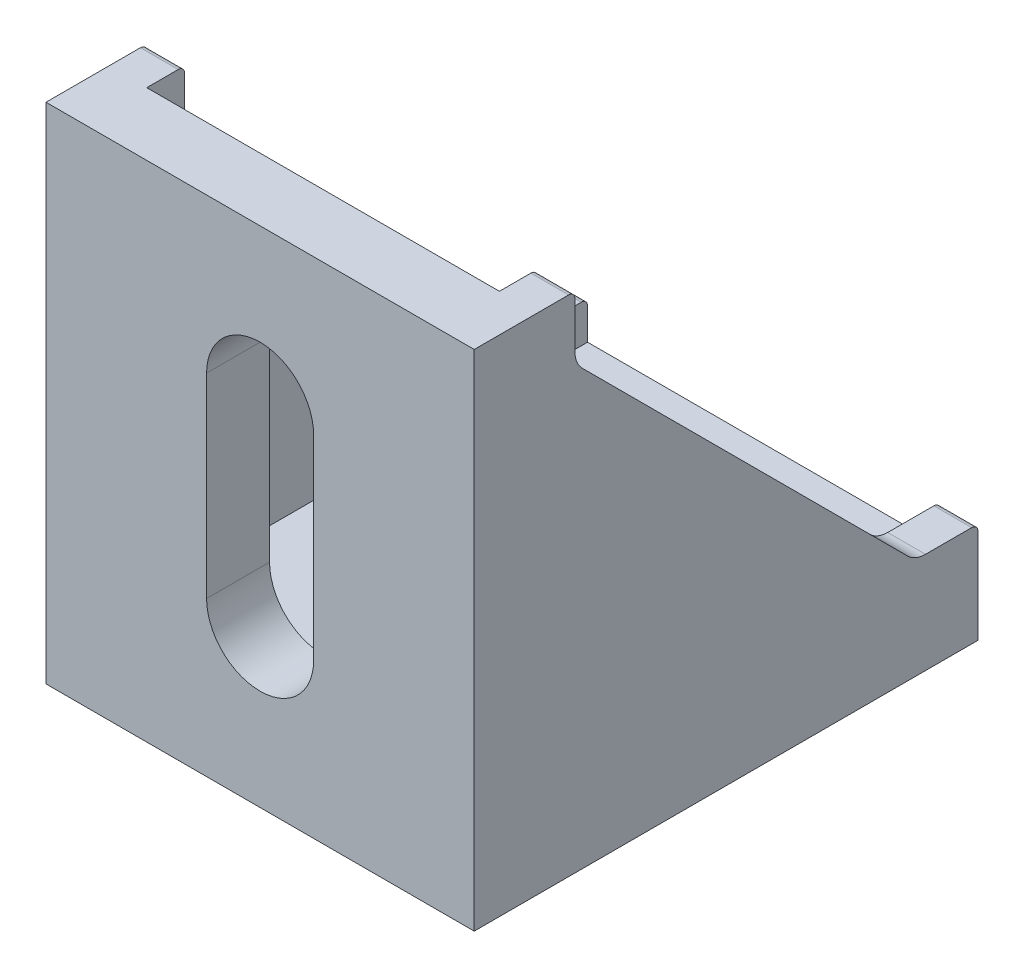
ISO-10303-21;
HEADER;
FILE_DESCRIPTION(('STEP AP214'),'2;1');
FILE_NAME('part.step','',(''),(''),'','','');
FILE_SCHEMA(('AUTOMOTIVE_DESIGN { 1 0 10303 214 1 1 1 1 }'));
ENDSEC;
DATA;
#1=APPLICATION_CONTEXT('core data for automotive mechanical design processes');
#2=APPLICATION_PROTOCOL_DEFINITION('international standard','automotive_design',2000,#1);
#3=PRODUCT_CONTEXT('',#1,'mechanical');
#4=PRODUCT('Part','Part','',(#3));
#5=PRODUCT_RELATED_PRODUCT_CATEGORY('part','',(#4));
#6=PRODUCT_DEFINITION_FORMATION('','',#4);
#7=PRODUCT_DEFINITION_CONTEXT('part definition',#1,'design');
#8=PRODUCT_DEFINITION('design','',#6,#7);
#9=PRODUCT_DEFINITION_SHAPE('','',#8);
#10=(LENGTH_UNIT() NAMED_UNIT(*) SI_UNIT(.MILLI.,.METRE.));
#11=(NAMED_UNIT(*) PLANE_ANGLE_UNIT() SI_UNIT($,.RADIAN.));
#12=(NAMED_UNIT(*) SI_UNIT($,.STERADIAN.) SOLID_ANGLE_UNIT());
#13=UNCERTAINTY_MEASURE_WITH_UNIT(LENGTH_MEASURE(1.E-05),#10,'distance_accuracy_value','');
#14=(GEOMETRIC_REPRESENTATION_CONTEXT(3) GLOBAL_UNCERTAINTY_ASSIGNED_CONTEXT((#13)) GLOBAL_UNIT_ASSIGNED_CONTEXT((#10,
#11,#12)) REPRESENTATION_CONTEXT('',''));
#15=CARTESIAN_POINT('',(0.,0.,0.));
#16=DIRECTION('',(0.,0.,1.));
#17=DIRECTION('',(1.,0.,0.));
#18=AXIS2_PLACEMENT_3D('',#15,#16,#17);
#19=CARTESIAN_POINT('',(34.,15.8284271247466,9.99999999999973));
#20=DIRECTION('',(-1.,0.,0.));
#21=DIRECTION('',(0.,0.,1.));
#22=AXIS2_PLACEMENT_3D('',#19,#20,#21);
#23=CYLINDRICAL_SURFACE('',#22,2.);
#24=DIRECTION('',(-1.,0.,0.));
#25=VECTOR('',#24,1.);
#26=CARTESIAN_POINT('',(34.,14.4142135623735,11.4142135623728));
#27=LINE('',#26,#25);
#28=CARTESIAN_POINT('',(34.,14.4142135623735,11.4142135623728));
#29=VERTEX_POINT('',#28);
#30=CARTESIAN_POINT('',(31.,14.4142135623735,11.4142135623728));
#31=VERTEX_POINT('',#30);
#32=EDGE_CURVE('E393',#29,#31,#27,.T.);
#33=ORIENTED_EDGE('',*,*,#32,.T.);
#34=CARTESIAN_POINT('',(31.,15.8284271247466,9.99999999999973));
#35=DIRECTION('',(1.,0.,0.));
#36=DIRECTION('',(0.,0.,-1.));
#37=AXIS2_PLACEMENT_3D('',#34,#35,#36);
#38=CIRCLE('',#37,2.);
#39=CARTESIAN_POINT('',(31.,15.8284271247465,11.9999999999997));
#40=VERTEX_POINT('',#39);
#41=EDGE_CURVE('E330',#31,#40,#38,.F.);
#42=ORIENTED_EDGE('',*,*,#41,.T.);
#43=DIRECTION('',(-1.,0.,0.));
#44=VECTOR('',#43,1.);
#45=CARTESIAN_POINT('',(34.,15.8284271247465,11.9999999999997));
#46=LINE('',#45,#44);
#47=CARTESIAN_POINT('',(34.,15.8284271247465,11.9999999999997));
#48=VERTEX_POINT('',#47);
#49=EDGE_CURVE('E430',#48,#40,#46,.T.);
#50=ORIENTED_EDGE('',*,*,#49,.F.);
#51=CARTESIAN_POINT('',(34.,15.8284271247466,9.99999999999973));
#52=DIRECTION('',(-1.,0.,0.));
#53=DIRECTION('',(0.,0.,1.));
#54=AXIS2_PLACEMENT_3D('',#51,#52,#53);
#55=CIRCLE('',#54,2.);
#56=EDGE_CURVE('E340',#29,#48,#55,.T.);
#57=ORIENTED_EDGE('',*,*,#56,.F.);
#58=EDGE_LOOP('',(#33,#42,#50,#57));
#59=FACE_BOUND('',#58,.T.);
#60=ADVANCED_FACE('F32',(#59),#23,.F.);
#61=CARTESIAN_POINT('',(34.,15.8284271247465,11.9999999999997));
#62=DIRECTION('',(0.,0.,1.));
#63=DIRECTION('',(0.,-1.,0.));
#64=AXIS2_PLACEMENT_3D('',#61,#62,#63);
#65=PLANE('',#64);
#66=ORIENTED_EDGE('',*,*,#49,.T.);
#67=DIRECTION('',(0.,1.,0.));
#68=VECTOR('',#67,1.);
#69=CARTESIAN_POINT('',(31.,15.8284271247465,11.9999999999997));
#70=LINE('',#69,#68);
#71=CARTESIAN_POINT('',(31.,19.5,12.));
#72=VERTEX_POINT('',#71);
#73=EDGE_CURVE('E333',#40,#72,#70,.T.);
#74=ORIENTED_EDGE('',*,*,#73,.T.);
#75=DIRECTION('',(-1.,0.,0.));
#76=VECTOR('',#75,1.);
#77=CARTESIAN_POINT('',(34.,19.5,12.));
#78=LINE('',#77,#76);
#79=CARTESIAN_POINT('',(34.,19.5,12.));
#80=VERTEX_POINT('',#79);
#81=EDGE_CURVE('E426',#80,#72,#78,.T.);
#82=ORIENTED_EDGE('',*,*,#81,.F.);
#83=DIRECTION('',(0.,1.,0.));
#84=VECTOR('',#83,1.);
#85=CARTESIAN_POINT('',(34.,15.8284271247465,11.9999999999997));
#86=LINE('',#85,#84);
#87=EDGE_CURVE('E343',#48,#80,#86,.T.);
#88=ORIENTED_EDGE('',*,*,#87,.F.);
#89=EDGE_LOOP('',(#66,#74,#82,#88));
#90=FACE_BOUND('',#89,.T.);
#91=ADVANCED_FACE('F478',(#90),#65,.F.);
#92=CARTESIAN_POINT('',(34.,19.5,12.5));
#93=DIRECTION('',(-1.,0.,0.));
#94=DIRECTION('',(0.,0.,1.));
#95=AXIS2_PLACEMENT_3D('',#92,#93,#94);
#96=CYLINDRICAL_SURFACE('',#95,0.5);
#97=ORIENTED_EDGE('',*,*,#81,.T.);
#98=CARTESIAN_POINT('',(31.,19.5,12.5));
#99=DIRECTION('',(1.,0.,0.));
#100=DIRECTION('',(0.,0.,-1.));
#101=AXIS2_PLACEMENT_3D('',#98,#99,#100);
#102=CIRCLE('',#101,0.5);
#103=CARTESIAN_POINT('',(31.,20.,12.5));
#104=VERTEX_POINT('',#103);
#105=EDGE_CURVE('E336',#72,#104,#102,.T.);
#106=ORIENTED_EDGE('',*,*,#105,.T.);
#107=DIRECTION('',(-1.,0.,0.));
#108=VECTOR('',#107,1.);
#109=CARTESIAN_POINT('',(34.,20.,12.5));
#110=LINE('',#109,#108);
#111=CARTESIAN_POINT('',(34.,20.,12.5));
#112=VERTEX_POINT('',#111);
#113=EDGE_CURVE('E422',#112,#104,#110,.T.);
#114=ORIENTED_EDGE('',*,*,#113,.F.);
#115=CARTESIAN_POINT('',(34.,19.5,12.5));
#116=DIRECTION('',(1.,0.,0.));
#117=DIRECTION('',(0.,0.,1.));
#118=AXIS2_PLACEMENT_3D('',#115,#116,#117);
#119=CIRCLE('',#118,0.5);
#120=EDGE_CURVE('E346',#80,#112,#119,.T.);
#121=ORIENTED_EDGE('',*,*,#120,.F.);
#122=EDGE_LOOP('',(#97,#106,#114,#121));
#123=FACE_BOUND('',#122,.T.);
#124=ADVANCED_FACE('F483',(#123),#96,.T.);
#125=CARTESIAN_POINT('',(34.,-12.5,-19.5));
#126=DIRECTION('',(-1.,0.,0.));
#127=DIRECTION('',(0.,0.,1.));
#128=AXIS2_PLACEMENT_3D('',#125,#126,#127);
#129=CYLINDRICAL_SURFACE('',#128,0.5);
#130=DIRECTION('',(-1.,0.,0.));
#131=VECTOR('',#130,1.);
#132=CARTESIAN_POINT('',(34.,-12.5,-20.));
#133=LINE('',#132,#131);
#134=CARTESIAN_POINT('',(34.,-12.5,-20.));
#135=VERTEX_POINT('',#134);
#136=CARTESIAN_POINT('',(31.,-12.5,-20.));
#137=VERTEX_POINT('',#136);
#138=EDGE_CURVE('E409',#135,#137,#133,.T.);
#139=ORIENTED_EDGE('',*,*,#138,.T.);
#140=CARTESIAN_POINT('',(31.,-12.5,-19.5));
#141=DIRECTION('',(1.,0.,0.));
#142=DIRECTION('',(0.,0.,-1.));
#143=AXIS2_PLACEMENT_3D('',#140,#141,#142);
#144=CIRCLE('',#143,0.5);
#145=CARTESIAN_POINT('',(31.,-12.,-19.5));
#146=VERTEX_POINT('',#145);
#147=EDGE_CURVE('E324',#137,#146,#144,.T.);
#148=ORIENTED_EDGE('',*,*,#147,.T.);
#149=DIRECTION('',(-1.,0.,0.));
#150=VECTOR('',#149,1.);
#151=CARTESIAN_POINT('',(34.,-12.,-19.5));
#152=LINE('',#151,#150);
#153=CARTESIAN_POINT('',(34.,-12.,-19.5));
#154=VERTEX_POINT('',#153);
#155=EDGE_CURVE('E405',#154,#146,#152,.T.);
#156=ORIENTED_EDGE('',*,*,#155,.F.);
#157=CARTESIAN_POINT('',(34.,-12.5,-19.5));
#158=DIRECTION('',(1.,0.,0.));
#159=DIRECTION('',(0.,0.,1.));
#160=AXIS2_PLACEMENT_3D('',#157,#158,#159);
#161=CIRCLE('',#160,0.5);
#162=EDGE_CURVE('E356',#135,#154,#161,.T.);
#163=ORIENTED_EDGE('',*,*,#162,.F.);
#164=EDGE_LOOP('',(#139,#148,#156,#163));
#165=FACE_BOUND('',#164,.T.);
#166=ADVANCED_FACE('F574',(#165),#129,.T.);
#167=CARTESIAN_POINT('',(34.,-12.,-15.8284271247469));
#168=DIRECTION('',(0.,-1.,0.));
#169=DIRECTION('',(0.,0.,-1.));
#170=AXIS2_PLACEMENT_3D('',#167,#168,#169);
#171=PLANE('',#170);
#172=ORIENTED_EDGE('',*,*,#155,.T.);
#173=DIRECTION('',(0.,0.,1.));
#174=VECTOR('',#173,1.);
#175=CARTESIAN_POINT('',(31.,-12.,-15.8284271247469));
#176=LINE('',#175,#174);
#177=CARTESIAN_POINT('',(31.,-12.,-15.8284271247469));
#178=VERTEX_POINT('',#177);
#179=EDGE_CURVE('E321',#146,#178,#176,.T.);
#180=ORIENTED_EDGE('',*,*,#179,.T.);
#181=DIRECTION('',(-1.,0.,0.));
#182=VECTOR('',#181,1.);
#183=CARTESIAN_POINT('',(34.,-12.,-15.8284271247469));
#184=LINE('',#183,#182);
#185=CARTESIAN_POINT('',(34.,-12.,-15.8284271247469));
#186=VERTEX_POINT('',#185);
#187=EDGE_CURVE('E401',#186,#178,#184,.T.);
#188=ORIENTED_EDGE('',*,*,#187,.F.);
#189=DIRECTION('',(0.,0.,1.));
#190=VECTOR('',#189,1.);
#191=CARTESIAN_POINT('',(34.,-12.,-15.8284271247469));
#192=LINE('',#191,#190);
#193=EDGE_CURVE('E358',#154,#186,#192,.T.);
#194=ORIENTED_EDGE('',*,*,#193,.F.);
#195=EDGE_LOOP('',(#172,#180,#188,#194));
#196=FACE_BOUND('',#195,.T.);
#197=ADVANCED_FACE('F571',(#196),#171,.F.);
#198=CARTESIAN_POINT('',(34.,-9.99999999999998,-15.8284271247468));
#199=DIRECTION('',(-1.,0.,0.));
#200=DIRECTION('',(0.,0.,1.));
#201=AXIS2_PLACEMENT_3D('',#198,#199,#200);
#202=CYLINDRICAL_SURFACE('',#201,2.);
#203=ORIENTED_EDGE('',*,*,#187,.T.);
#204=CARTESIAN_POINT('',(31.,-9.99999999999998,-15.8284271247468));
#205=DIRECTION('',(1.,0.,0.));
#206=DIRECTION('',(0.,0.,-1.));
#207=AXIS2_PLACEMENT_3D('',#204,#205,#206);
#208=CIRCLE('',#207,2.);
#209=CARTESIAN_POINT('',(31.,-11.4142135623731,-14.4142135623737));
#210=VERTEX_POINT('',#209);
#211=EDGE_CURVE('E318',#178,#210,#208,.F.);
#212=ORIENTED_EDGE('',*,*,#211,.T.);
#213=DIRECTION('',(-1.,0.,0.));
#214=VECTOR('',#213,1.);
#215=CARTESIAN_POINT('',(34.,-11.4142135623731,-14.4142135623737));
#216=LINE('',#215,#214);
#217=CARTESIAN_POINT('',(34.,-11.4142135623731,-14.4142135623737));
#218=VERTEX_POINT('',#217);
#219=EDGE_CURVE('E397',#218,#210,#216,.T.);
#220=ORIENTED_EDGE('',*,*,#219,.F.);
#221=CARTESIAN_POINT('',(34.,-9.99999999999998,-15.8284271247468));
#222=DIRECTION('',(-1.,0.,0.));
#223=DIRECTION('',(0.,0.,-1.));
#224=AXIS2_PLACEMENT_3D('',#221,#222,#223);
#225=CIRCLE('',#224,2.);
#226=EDGE_CURVE('E360',#186,#218,#225,.T.);
#227=ORIENTED_EDGE('',*,*,#226,.F.);
#228=EDGE_LOOP('',(#203,#212,#220,#227));
#229=FACE_BOUND('',#228,.T.);
#230=ADVANCED_FACE('F495',(#229),#202,.F.);
#231=CARTESIAN_POINT('',(34.,14.4142135623735,11.4142135623728));
#232=DIRECTION('',(0.,-0.707106781186548,0.707106781186547));
#233=DIRECTION('',(0.,-0.707106781186547,-0.707106781186548));
#234=AXIS2_PLACEMENT_3D('',#231,#232,#233);
#235=PLANE('',#234);
#236=ORIENTED_EDGE('',*,*,#219,.T.);
#237=DIRECTION('',(0.,0.707106781186547,0.707106781186548));
#238=VECTOR('',#237,1.);
#239=CARTESIAN_POINT('',(31.,14.4142135623735,11.4142135623728));
#240=LINE('',#239,#238);
#241=EDGE_CURVE('E436',#210,#31,#240,.T.);
#242=ORIENTED_EDGE('',*,*,#241,.T.);
#243=ORIENTED_EDGE('',*,*,#32,.F.);
#244=DIRECTION('',(0.,0.707106781186547,0.707106781186548));
#245=VECTOR('',#244,1.);
#246=CARTESIAN_POINT('',(34.,14.4142135623735,11.4142135623728));
#247=LINE('',#246,#245);
#248=EDGE_CURVE('E362',#218,#29,#247,.T.);
#249=ORIENTED_EDGE('',*,*,#248,.F.);
#250=EDGE_LOOP('',(#236,#242,#243,#249));
#251=FACE_BOUND('',#250,.T.);
#252=ADVANCED_FACE('F487',(#251),#235,.F.);
#253=CARTESIAN_POINT('',(3.,15.8284271247466,11.9999999999997));
#254=VERTEX_POINT('',#253);
#255=CARTESIAN_POINT('',(0.,15.8284271247465,11.9999999999997));
#256=VERTEX_POINT('',#255);
#257=EDGE_CURVE('E429',#254,#256,#46,.T.);
#258=ORIENTED_EDGE('',*,*,#257,.F.);
#259=CARTESIAN_POINT('',(3.,15.8284271247466,9.99999999999973));
#260=DIRECTION('',(-1.,0.,0.));
#261=DIRECTION('',(0.,0.,1.));
#262=AXIS2_PLACEMENT_3D('',#259,#260,#261);
#263=CIRCLE('',#262,2.);
#264=CARTESIAN_POINT('',(3.,14.4142135623735,11.4142135623728));
#265=VERTEX_POINT('',#264);
#266=EDGE_CURVE('E309',#254,#265,#263,.F.);
#267=ORIENTED_EDGE('',*,*,#266,.T.);
#268=CARTESIAN_POINT('',(0.,14.4142135623735,11.4142135623728));
#269=VERTEX_POINT('',#268);
#270=EDGE_CURVE('E364',#265,#269,#27,.T.);
#271=ORIENTED_EDGE('',*,*,#270,.T.);
#272=CARTESIAN_POINT('',(0.,15.8284271247466,9.99999999999973));
#273=DIRECTION('',(-1.,0.,0.));
#274=DIRECTION('',(0.,0.,1.));
#275=AXIS2_PLACEMENT_3D('',#272,#273,#274);
#276=CIRCLE('',#275,2.);
#277=EDGE_CURVE('E339',#269,#256,#276,.T.);
#278=ORIENTED_EDGE('',*,*,#277,.T.);
#279=EDGE_LOOP('',(#258,#267,#271,#278));
#280=FACE_BOUND('',#279,.T.);
#281=ADVANCED_FACE('F34',(#280),#23,.F.);
#282=CARTESIAN_POINT('',(3.,19.5,12.));
#283=VERTEX_POINT('',#282);
#284=CARTESIAN_POINT('',(0.,19.5,12.));
#285=VERTEX_POINT('',#284);
#286=EDGE_CURVE('E425',#283,#285,#78,.T.);
#287=ORIENTED_EDGE('',*,*,#286,.F.);
#288=DIRECTION('',(0.,-1.,0.));
#289=VECTOR('',#288,1.);
#290=CARTESIAN_POINT('',(3.,15.8284271247465,11.9999999999997));
#291=LINE('',#290,#289);
#292=EDGE_CURVE('E312',#283,#254,#291,.T.);
#293=ORIENTED_EDGE('',*,*,#292,.T.);
#294=ORIENTED_EDGE('',*,*,#257,.T.);
#295=DIRECTION('',(0.,1.,0.));
#296=VECTOR('',#295,1.);
#297=CARTESIAN_POINT('',(0.,15.8284271247465,11.9999999999997));
#298=LINE('',#297,#296);
#299=EDGE_CURVE('E367',#256,#285,#298,.T.);
#300=ORIENTED_EDGE('',*,*,#299,.T.);
#301=EDGE_LOOP('',(#287,#293,#294,#300));
#302=FACE_BOUND('',#301,.T.);
#303=ADVANCED_FACE('F485',(#302),#65,.F.);
#304=CARTESIAN_POINT('',(3.,20.,12.5));
#305=VERTEX_POINT('',#304);
#306=CARTESIAN_POINT('',(0.,20.,12.5));
#307=VERTEX_POINT('',#306);
#308=EDGE_CURVE('E421',#305,#307,#110,.T.);
#309=ORIENTED_EDGE('',*,*,#308,.F.);
#310=CARTESIAN_POINT('',(3.,19.5,12.5));
#311=DIRECTION('',(-1.,0.,0.));
#312=DIRECTION('',(0.,0.,1.));
#313=AXIS2_PLACEMENT_3D('',#310,#311,#312);
#314=CIRCLE('',#313,0.5);
#315=EDGE_CURVE('E315',#305,#283,#314,.T.);
#316=ORIENTED_EDGE('',*,*,#315,.T.);
#317=ORIENTED_EDGE('',*,*,#286,.T.);
#318=CARTESIAN_POINT('',(0.,19.5,12.5));
#319=DIRECTION('',(1.,0.,0.));
#320=DIRECTION('',(0.,0.,1.));
#321=AXIS2_PLACEMENT_3D('',#318,#319,#320);
#322=CIRCLE('',#321,0.5);
#323=EDGE_CURVE('E370',#285,#307,#322,.T.);
#324=ORIENTED_EDGE('',*,*,#323,.T.);
#325=EDGE_LOOP('',(#309,#316,#317,#324));
#326=FACE_BOUND('',#325,.T.);
#327=ADVANCED_FACE('F493',(#326),#96,.T.);
#328=CARTESIAN_POINT('',(34.,20.,20.));
#329=DIRECTION('',(0.,-1.,0.));
#330=DIRECTION('',(0.,0.,-1.));
#331=AXIS2_PLACEMENT_3D('',#328,#329,#330);
#332=PLANE('',#331);
#333=ORIENTED_EDGE('',*,*,#113,.T.);
#334=DIRECTION('',(0.,0.,-1.));
#335=VECTOR('',#334,1.);
#336=CARTESIAN_POINT('',(31.,20.,-23.6124778709363));
#337=LINE('',#336,#335);
#338=CARTESIAN_POINT('',(31.,20.,15.));
#339=VERTEX_POINT('',#338);
#340=EDGE_CURVE('E281',#339,#104,#337,.T.);
#341=ORIENTED_EDGE('',*,*,#340,.F.);
#342=DIRECTION('',(1.,0.,0.));
#343=VECTOR('',#342,1.);
#344=CARTESIAN_POINT('',(31.,20.,15.));
#345=LINE('',#344,#343);
#346=CARTESIAN_POINT('',(3.,20.,15.));
#347=VERTEX_POINT('',#346);
#348=EDGE_CURVE('E289',#347,#339,#345,.T.);
#349=ORIENTED_EDGE('',*,*,#348,.F.);
#350=DIRECTION('',(0.,0.,1.));
#351=VECTOR('',#350,1.);
#352=CARTESIAN_POINT('',(3.,20.,15.));
#353=LINE('',#352,#351);
#354=EDGE_CURVE('E271',#305,#347,#353,.T.);
#355=ORIENTED_EDGE('',*,*,#354,.F.);
#356=ORIENTED_EDGE('',*,*,#308,.T.);
#357=DIRECTION('',(0.,0.,1.));
#358=VECTOR('',#357,1.);
#359=CARTESIAN_POINT('',(0.,20.,20.));
#360=LINE('',#359,#358);
#361=CARTESIAN_POINT('',(0.,20.,20.));
#362=VERTEX_POINT('',#361);
#363=EDGE_CURVE('E373',#307,#362,#360,.T.);
#364=ORIENTED_EDGE('',*,*,#363,.T.);
#365=DIRECTION('',(-1.,0.,0.));
#366=VECTOR('',#365,1.);
#367=CARTESIAN_POINT('',(34.,20.,20.));
#368=LINE('',#367,#366);
#369=CARTESIAN_POINT('',(34.,20.,20.));
#370=VERTEX_POINT('',#369);
#371=EDGE_CURVE('E418',#370,#362,#368,.T.);
#372=ORIENTED_EDGE('',*,*,#371,.F.);
#373=DIRECTION('',(0.,0.,1.));
#374=VECTOR('',#373,1.);
#375=CARTESIAN_POINT('',(34.,20.,20.));
#376=LINE('',#375,#374);
#377=EDGE_CURVE('E348',#112,#370,#376,.T.);
#378=ORIENTED_EDGE('',*,*,#377,.F.);
#379=EDGE_LOOP('',(#333,#341,#349,#355,#356,#364,#372,#378));
#380=FACE_BOUND('',#379,.T.);
#381=ADVANCED_FACE('F518',(#380),#332,.F.);
#382=CARTESIAN_POINT('',(34.,-20.,20.));
#383=DIRECTION('',(0.,0.,-1.));
#384=DIRECTION('',(-1.,0.,0.));
#385=AXIS2_PLACEMENT_3D('',#382,#383,#384);
#386=PLANE('',#385);
#387=DIRECTION('',(0.,-1.,0.));
#388=VECTOR('',#387,1.);
#389=CARTESIAN_POINT('',(12.75,7.75000000000002,20.));
#390=LINE('',#389,#388);
#391=CARTESIAN_POINT('',(12.75,7.75000000000001,20.));
#392=VERTEX_POINT('',#391);
#393=CARTESIAN_POINT('',(12.75,-7.74999999999998,20.));
#394=VERTEX_POINT('',#393);
#395=EDGE_CURVE('E241',#392,#394,#390,.T.);
#396=ORIENTED_EDGE('',*,*,#395,.F.);
#397=CARTESIAN_POINT('',(17.,7.75000000000002,20.));
#398=DIRECTION('',(0.,0.,1.));
#399=DIRECTION('',(1.,0.,0.));
#400=AXIS2_PLACEMENT_3D('',#397,#398,#399);
#401=CIRCLE('',#400,4.25);
#402=CARTESIAN_POINT('',(21.25,7.75000000000002,20.));
#403=VERTEX_POINT('',#402);
#404=EDGE_CURVE('E47',#403,#392,#401,.T.);
#405=ORIENTED_EDGE('',*,*,#404,.F.);
#406=DIRECTION('',(0.,1.,0.));
#407=VECTOR('',#406,1.);
#408=CARTESIAN_POINT('',(21.25,7.75000000000002,20.));
#409=LINE('',#408,#407);
#410=CARTESIAN_POINT('',(21.25,-7.74999999999998,20.));
#411=VERTEX_POINT('',#410);
#412=EDGE_CURVE('E248',#411,#403,#409,.T.);
#413=ORIENTED_EDGE('',*,*,#412,.F.);
#414=CARTESIAN_POINT('',(17.,-7.74999999999998,20.));
#415=DIRECTION('',(0.,0.,1.));
#416=DIRECTION('',(-1.,0.,0.));
#417=AXIS2_PLACEMENT_3D('',#414,#415,#416);
#418=CIRCLE('',#417,4.25);
#419=EDGE_CURVE('E232',#394,#411,#418,.T.);
#420=ORIENTED_EDGE('',*,*,#419,.F.);
#421=EDGE_LOOP('',(#396,#405,#413,#420));
#422=FACE_BOUND('',#421,.T.);
#423=DIRECTION('',(0.,-1.,0.));
#424=VECTOR('',#423,1.);
#425=CARTESIAN_POINT('',(0.,-20.,20.));
#426=LINE('',#425,#424);
#427=CARTESIAN_POINT('',(0.,-20.,20.));
#428=VERTEX_POINT('',#427);
#429=EDGE_CURVE('E375',#362,#428,#426,.T.);
#430=ORIENTED_EDGE('',*,*,#429,.T.);
#431=DIRECTION('',(-1.,0.,0.));
#432=VECTOR('',#431,1.);
#433=CARTESIAN_POINT('',(34.,-20.,20.));
#434=LINE('',#433,#432);
#435=CARTESIAN_POINT('',(34.,-20.,20.));
#436=VERTEX_POINT('',#435);
#437=EDGE_CURVE('E415',#436,#428,#434,.T.);
#438=ORIENTED_EDGE('',*,*,#437,.F.);
#439=DIRECTION('',(0.,-1.,0.));
#440=VECTOR('',#439,1.);
#441=CARTESIAN_POINT('',(34.,-20.,20.));
#442=LINE('',#441,#440);
#443=EDGE_CURVE('E350',#370,#436,#442,.T.);
#444=ORIENTED_EDGE('',*,*,#443,.F.);
#445=ORIENTED_EDGE('',*,*,#371,.T.);
#446=EDGE_LOOP('',(#430,#438,#444,#445));
#447=FACE_BOUND('',#446,.T.);
#448=ADVANCED_FACE('F245',(#422,#447),#386,.F.);
#449=CARTESIAN_POINT('',(34.,-20.,20.));
#450=DIRECTION('',(0.,1.,0.));
#451=DIRECTION('',(0.,0.,1.));
#452=AXIS2_PLACEMENT_3D('',#449,#450,#451);
#453=PLANE('',#452);
#454=DIRECTION('',(0.,0.,-1.));
#455=VECTOR('',#454,1.);
#456=CARTESIAN_POINT('',(12.75,-20.,7.75));
#457=LINE('',#456,#455);
#458=CARTESIAN_POINT('',(12.75,-20.,7.75));
#459=VERTEX_POINT('',#458);
#460=CARTESIAN_POINT('',(12.75,-20.,-7.75000000000001));
#461=VERTEX_POINT('',#460);
#462=EDGE_CURVE('E259',#459,#461,#457,.T.);
#463=ORIENTED_EDGE('',*,*,#462,.F.);
#464=CARTESIAN_POINT('',(17.,-20.,7.75));
#465=DIRECTION('',(0.,-1.,0.));
#466=DIRECTION('',(0.,0.,-1.));
#467=AXIS2_PLACEMENT_3D('',#464,#465,#466);
#468=CIRCLE('',#467,4.25);
#469=CARTESIAN_POINT('',(21.25,-20.,7.75));
#470=VERTEX_POINT('',#469);
#471=EDGE_CURVE('E255',#470,#459,#468,.T.);
#472=ORIENTED_EDGE('',*,*,#471,.F.);
#473=DIRECTION('',(0.,0.,1.));
#474=VECTOR('',#473,1.);
#475=CARTESIAN_POINT('',(21.25,-20.,7.75));
#476=LINE('',#475,#474);
#477=CARTESIAN_POINT('',(21.25,-20.,-7.75));
#478=VERTEX_POINT('',#477);
#479=EDGE_CURVE('E265',#478,#470,#476,.T.);
#480=ORIENTED_EDGE('',*,*,#479,.F.);
#481=CARTESIAN_POINT('',(17.,-20.,-7.75));
#482=DIRECTION('',(0.,-1.,0.));
#483=DIRECTION('',(0.,0.,1.));
#484=AXIS2_PLACEMENT_3D('',#481,#482,#483);
#485=CIRCLE('',#484,4.25);
#486=EDGE_CURVE('E262',#461,#478,#485,.T.);
#487=ORIENTED_EDGE('',*,*,#486,.F.);
#488=EDGE_LOOP('',(#463,#472,#480,#487));
#489=FACE_BOUND('',#488,.T.);
#490=DIRECTION('',(0.,0.,-1.));
#491=VECTOR('',#490,1.);
#492=CARTESIAN_POINT('',(0.,-20.,20.));
#493=LINE('',#492,#491);
#494=CARTESIAN_POINT('',(0.,-20.,-20.));
#495=VERTEX_POINT('',#494);
#496=EDGE_CURVE('E377',#428,#495,#493,.T.);
#497=ORIENTED_EDGE('',*,*,#496,.T.);
#498=DIRECTION('',(-1.,0.,0.));
#499=VECTOR('',#498,1.);
#500=CARTESIAN_POINT('',(34.,-20.,-20.));
#501=LINE('',#500,#499);
#502=CARTESIAN_POINT('',(34.,-20.,-20.));
#503=VERTEX_POINT('',#502);
#504=EDGE_CURVE('E412',#503,#495,#501,.T.);
#505=ORIENTED_EDGE('',*,*,#504,.F.);
#506=DIRECTION('',(0.,0.,-1.));
#507=VECTOR('',#506,1.);
#508=CARTESIAN_POINT('',(34.,-20.,20.));
#509=LINE('',#508,#507);
#510=EDGE_CURVE('E352',#436,#503,#509,.T.);
#511=ORIENTED_EDGE('',*,*,#510,.F.);
#512=ORIENTED_EDGE('',*,*,#437,.T.);
#513=EDGE_LOOP('',(#497,#505,#511,#512));
#514=FACE_BOUND('',#513,.T.);
#515=ADVANCED_FACE('F544',(#489,#514),#453,.F.);
#516=CARTESIAN_POINT('',(34.,-20.,-20.));
#517=DIRECTION('',(0.,0.,1.));
#518=DIRECTION('',(1.,0.,0.));
#519=AXIS2_PLACEMENT_3D('',#516,#517,#518);
#520=PLANE('',#519);
#521=DIRECTION('',(1.,0.,0.));
#522=VECTOR('',#521,1.);
#523=CARTESIAN_POINT('',(34.,-15.,-20.));
#524=LINE('',#523,#522);
#525=CARTESIAN_POINT('',(3.,-15.,-20.));
#526=VERTEX_POINT('',#525);
#527=CARTESIAN_POINT('',(31.,-15.,-20.));
#528=VERTEX_POINT('',#527);
#529=EDGE_CURVE('E439',#526,#528,#524,.T.);
#530=ORIENTED_EDGE('',*,*,#529,.T.);
#531=DIRECTION('',(0.,1.,0.));
#532=VECTOR('',#531,1.);
#533=CARTESIAN_POINT('',(31.,-20.,-20.));
#534=LINE('',#533,#532);
#535=EDGE_CURVE('E327',#528,#137,#534,.T.);
#536=ORIENTED_EDGE('',*,*,#535,.T.);
#537=ORIENTED_EDGE('',*,*,#138,.F.);
#538=DIRECTION('',(0.,1.,0.));
#539=VECTOR('',#538,1.);
#540=CARTESIAN_POINT('',(34.,-20.,-20.));
#541=LINE('',#540,#539);
#542=EDGE_CURVE('E354',#503,#135,#541,.T.);
#543=ORIENTED_EDGE('',*,*,#542,.F.);
#544=ORIENTED_EDGE('',*,*,#504,.T.);
#545=DIRECTION('',(0.,1.,0.));
#546=VECTOR('',#545,1.);
#547=CARTESIAN_POINT('',(0.,-20.,-20.));
#548=LINE('',#547,#546);
#549=CARTESIAN_POINT('',(0.,-12.5,-20.));
#550=VERTEX_POINT('',#549);
#551=EDGE_CURVE('E379',#495,#550,#548,.T.);
#552=ORIENTED_EDGE('',*,*,#551,.T.);
#553=CARTESIAN_POINT('',(3.,-12.5,-20.));
#554=VERTEX_POINT('',#553);
#555=EDGE_CURVE('E408',#554,#550,#133,.T.);
#556=ORIENTED_EDGE('',*,*,#555,.F.);
#557=DIRECTION('',(0.,-1.,0.));
#558=VECTOR('',#557,1.);
#559=CARTESIAN_POINT('',(3.,-20.,-20.));
#560=LINE('',#559,#558);
#561=EDGE_CURVE('E306',#554,#526,#560,.T.);
#562=ORIENTED_EDGE('',*,*,#561,.T.);
#563=EDGE_LOOP('',(#530,#536,#537,#543,#544,#552,#556,#562));
#564=FACE_BOUND('',#563,.T.);
#565=ADVANCED_FACE('F526',(#564),#520,.F.);
#566=CARTESIAN_POINT('',(3.,-12.,-19.5));
#567=VERTEX_POINT('',#566);
#568=CARTESIAN_POINT('',(0.,-12.,-19.5));
#569=VERTEX_POINT('',#568);
#570=EDGE_CURVE('E404',#567,#569,#152,.T.);
#571=ORIENTED_EDGE('',*,*,#570,.F.);
#572=CARTESIAN_POINT('',(3.,-12.5,-19.5));
#573=DIRECTION('',(-1.,0.,0.));
#574=DIRECTION('',(0.,0.,1.));
#575=AXIS2_PLACEMENT_3D('',#572,#573,#574);
#576=CIRCLE('',#575,0.5);
#577=EDGE_CURVE('E303',#567,#554,#576,.T.);
#578=ORIENTED_EDGE('',*,*,#577,.T.);
#579=ORIENTED_EDGE('',*,*,#555,.T.);
#580=CARTESIAN_POINT('',(0.,-12.5,-19.5));
#581=DIRECTION('',(1.,0.,0.));
#582=DIRECTION('',(0.,0.,1.));
#583=AXIS2_PLACEMENT_3D('',#580,#581,#582);
#584=CIRCLE('',#583,0.5);
#585=EDGE_CURVE('E382',#550,#569,#584,.T.);
#586=ORIENTED_EDGE('',*,*,#585,.T.);
#587=EDGE_LOOP('',(#571,#578,#579,#586));
#588=FACE_BOUND('',#587,.T.);
#589=ADVANCED_FACE('F531',(#588),#129,.T.);
#590=CARTESIAN_POINT('',(3.,-12.,-15.8284271247469));
#591=VERTEX_POINT('',#590);
#592=CARTESIAN_POINT('',(0.,-12.,-15.8284271247469));
#593=VERTEX_POINT('',#592);
#594=EDGE_CURVE('E400',#591,#593,#184,.T.);
#595=ORIENTED_EDGE('',*,*,#594,.F.);
#596=DIRECTION('',(0.,0.,-1.));
#597=VECTOR('',#596,1.);
#598=CARTESIAN_POINT('',(3.,-12.,-15.8284271247469));
#599=LINE('',#598,#597);
#600=EDGE_CURVE('E300',#591,#567,#599,.T.);
#601=ORIENTED_EDGE('',*,*,#600,.T.);
#602=ORIENTED_EDGE('',*,*,#570,.T.);
#603=DIRECTION('',(0.,0.,1.));
#604=VECTOR('',#603,1.);
#605=CARTESIAN_POINT('',(0.,-12.,-15.8284271247469));
#606=LINE('',#605,#604);
#607=EDGE_CURVE('E385',#569,#593,#606,.T.);
#608=ORIENTED_EDGE('',*,*,#607,.T.);
#609=EDGE_LOOP('',(#595,#601,#602,#608));
#610=FACE_BOUND('',#609,.T.);
#611=ADVANCED_FACE('F535',(#610),#171,.F.);
#612=CARTESIAN_POINT('',(3.,-11.4142135623731,-14.4142135623737));
#613=VERTEX_POINT('',#612);
#614=CARTESIAN_POINT('',(0.,-11.4142135623731,-14.4142135623737));
#615=VERTEX_POINT('',#614);
#616=EDGE_CURVE('E396',#613,#615,#216,.T.);
#617=ORIENTED_EDGE('',*,*,#616,.F.);
#618=CARTESIAN_POINT('',(3.,-9.99999999999998,-15.8284271247468));
#619=DIRECTION('',(-1.,0.,0.));
#620=DIRECTION('',(0.,0.,1.));
#621=AXIS2_PLACEMENT_3D('',#618,#619,#620);
#622=CIRCLE('',#621,2.);
#623=EDGE_CURVE('E295',#613,#591,#622,.F.);
#624=ORIENTED_EDGE('',*,*,#623,.T.);
#625=ORIENTED_EDGE('',*,*,#594,.T.);
#626=CARTESIAN_POINT('',(0.,-9.99999999999998,-15.8284271247468));
#627=DIRECTION('',(-1.,0.,0.));
#628=DIRECTION('',(0.,0.,-1.));
#629=AXIS2_PLACEMENT_3D('',#626,#627,#628);
#630=CIRCLE('',#629,2.);
#631=EDGE_CURVE('E388',#593,#615,#630,.T.);
#632=ORIENTED_EDGE('',*,*,#631,.T.);
#633=EDGE_LOOP('',(#617,#624,#625,#632));
#634=FACE_BOUND('',#633,.T.);
#635=ADVANCED_FACE('F539',(#634),#202,.F.);
#636=ORIENTED_EDGE('',*,*,#270,.F.);
#637=DIRECTION('',(0.,-0.707106781186547,-0.707106781186548));
#638=VECTOR('',#637,1.);
#639=CARTESIAN_POINT('',(3.,14.4142135623735,11.4142135623728));
#640=LINE('',#639,#638);
#641=EDGE_CURVE('E433',#265,#613,#640,.T.);
#642=ORIENTED_EDGE('',*,*,#641,.T.);
#643=ORIENTED_EDGE('',*,*,#616,.T.);
#644=DIRECTION('',(0.,0.707106781186547,0.707106781186548));
#645=VECTOR('',#644,1.);
#646=CARTESIAN_POINT('',(0.,14.4142135623735,11.4142135623728));
#647=LINE('',#646,#645);
#648=EDGE_CURVE('E344',#615,#269,#647,.T.);
#649=ORIENTED_EDGE('',*,*,#648,.T.);
#650=EDGE_LOOP('',(#636,#642,#643,#649));
#651=FACE_BOUND('',#650,.T.);
#652=ADVANCED_FACE('F498',(#651),#235,.F.);
#653=CARTESIAN_POINT('',(34.,15.8284271247466,9.99999999999973));
#654=DIRECTION('',(-1.,0.,0.));
#655=DIRECTION('',(0.,0.,1.));
#656=AXIS2_PLACEMENT_3D('',#653,#654,#655);
#657=PLANE('',#656);
#658=ORIENTED_EDGE('',*,*,#56,.T.);
#659=ORIENTED_EDGE('',*,*,#87,.T.);
#660=ORIENTED_EDGE('',*,*,#120,.T.);
#661=ORIENTED_EDGE('',*,*,#377,.T.);
#662=ORIENTED_EDGE('',*,*,#443,.T.);
#663=ORIENTED_EDGE('',*,*,#510,.T.);
#664=ORIENTED_EDGE('',*,*,#542,.T.);
#665=ORIENTED_EDGE('',*,*,#162,.T.);
#666=ORIENTED_EDGE('',*,*,#193,.T.);
#667=ORIENTED_EDGE('',*,*,#226,.T.);
#668=ORIENTED_EDGE('',*,*,#248,.T.);
#669=EDGE_LOOP('',(#658,#659,#660,#661,#662,#663,#664,#665,#666,#667,#668));
#670=FACE_BOUND('',#669,.T.);
#671=ADVANCED_FACE('F551',(#670),#657,.F.);
#672=CARTESIAN_POINT('',(0.,15.8284271247466,9.99999999999973));
#673=DIRECTION('',(-1.,0.,0.));
#674=DIRECTION('',(0.,0.,1.));
#675=AXIS2_PLACEMENT_3D('',#672,#673,#674);
#676=PLANE('',#675);
#677=ORIENTED_EDGE('',*,*,#277,.F.);
#678=ORIENTED_EDGE('',*,*,#648,.F.);
#679=ORIENTED_EDGE('',*,*,#631,.F.);
#680=ORIENTED_EDGE('',*,*,#607,.F.);
#681=ORIENTED_EDGE('',*,*,#585,.F.);
#682=ORIENTED_EDGE('',*,*,#551,.F.);
#683=ORIENTED_EDGE('',*,*,#496,.F.);
#684=ORIENTED_EDGE('',*,*,#429,.F.);
#685=ORIENTED_EDGE('',*,*,#363,.F.);
#686=ORIENTED_EDGE('',*,*,#323,.F.);
#687=ORIENTED_EDGE('',*,*,#299,.F.);
#688=EDGE_LOOP('',(#677,#678,#679,#680,#681,#682,#683,#684,#685,#686,#687));
#689=FACE_BOUND('',#688,.T.);
#690=ADVANCED_FACE('F506',(#689),#676,.T.);
#691=CARTESIAN_POINT('',(0.,-15.,0.));
#692=DIRECTION('',(0.,-1.,0.));
#693=DIRECTION('',(0.,0.,-1.));
#694=AXIS2_PLACEMENT_3D('',#691,#692,#693);
#695=PLANE('',#694);
#696=DIRECTION('',(0.,0.,1.));
#697=VECTOR('',#696,1.);
#698=CARTESIAN_POINT('',(21.25,-15.,0.));
#699=LINE('',#698,#697);
#700=CARTESIAN_POINT('',(21.25,-15.,-7.75));
#701=VERTEX_POINT('',#700);
#702=CARTESIAN_POINT('',(21.25,-15.,7.75));
#703=VERTEX_POINT('',#702);
#704=EDGE_CURVE('E448',#701,#703,#699,.T.);
#705=ORIENTED_EDGE('',*,*,#704,.T.);
#706=CARTESIAN_POINT('',(17.,-15.,7.75));
#707=DIRECTION('',(0.,-1.,0.));
#708=DIRECTION('',(0.,0.,-1.));
#709=AXIS2_PLACEMENT_3D('',#706,#707,#708);
#710=CIRCLE('',#709,4.25);
#711=CARTESIAN_POINT('',(12.75,-15.,7.75));
#712=VERTEX_POINT('',#711);
#713=EDGE_CURVE('E451',#703,#712,#710,.T.);
#714=ORIENTED_EDGE('',*,*,#713,.T.);
#715=DIRECTION('',(0.,0.,-1.));
#716=VECTOR('',#715,1.);
#717=CARTESIAN_POINT('',(12.75,-15.,0.));
#718=LINE('',#717,#716);
#719=CARTESIAN_POINT('',(12.75,-15.,-7.75000000000001));
#720=VERTEX_POINT('',#719);
#721=EDGE_CURVE('E442',#712,#720,#718,.T.);
#722=ORIENTED_EDGE('',*,*,#721,.T.);
#723=CARTESIAN_POINT('',(17.,-15.,-7.75));
#724=DIRECTION('',(0.,-1.,0.));
#725=DIRECTION('',(0.,0.,-1.));
#726=AXIS2_PLACEMENT_3D('',#723,#724,#725);
#727=CIRCLE('',#726,4.25);
#728=EDGE_CURVE('E445',#720,#701,#727,.T.);
#729=ORIENTED_EDGE('',*,*,#728,.T.);
#730=EDGE_LOOP('',(#705,#714,#722,#729));
#731=FACE_BOUND('',#730,.T.);
#732=DIRECTION('',(0.,0.,1.));
#733=VECTOR('',#732,1.);
#734=CARTESIAN_POINT('',(3.,-15.,12.));
#735=LINE('',#734,#733);
#736=CARTESIAN_POINT('',(3.,-15.,15.));
#737=VERTEX_POINT('',#736);
#738=EDGE_CURVE('E278',#526,#737,#735,.T.);
#739=ORIENTED_EDGE('',*,*,#738,.T.);
#740=DIRECTION('',(1.,0.,0.));
#741=VECTOR('',#740,1.);
#742=CARTESIAN_POINT('',(31.,-15.,15.));
#743=LINE('',#742,#741);
#744=CARTESIAN_POINT('',(31.,-15.,15.));
#745=VERTEX_POINT('',#744);
#746=EDGE_CURVE('E280',#737,#745,#743,.T.);
#747=ORIENTED_EDGE('',*,*,#746,.T.);
#748=DIRECTION('',(0.,0.,-1.));
#749=VECTOR('',#748,1.);
#750=CARTESIAN_POINT('',(31.,-15.,15.));
#751=LINE('',#750,#749);
#752=EDGE_CURVE('E284',#745,#528,#751,.T.);
#753=ORIENTED_EDGE('',*,*,#752,.T.);
#754=ORIENTED_EDGE('',*,*,#529,.F.);
#755=EDGE_LOOP('',(#739,#747,#753,#754));
#756=FACE_BOUND('',#755,.T.);
#757=ADVANCED_FACE('F575',(#731,#756),#695,.F.);
#758=CARTESIAN_POINT('',(31.,-15.,-23.6124778709363));
#759=DIRECTION('',(1.,0.,0.));
#760=DIRECTION('',(0.,0.,-1.));
#761=AXIS2_PLACEMENT_3D('',#758,#759,#760);
#762=PLANE('',#761);
#763=ORIENTED_EDGE('',*,*,#73,.F.);
#764=ORIENTED_EDGE('',*,*,#41,.F.);
#765=ORIENTED_EDGE('',*,*,#241,.F.);
#766=ORIENTED_EDGE('',*,*,#211,.F.);
#767=ORIENTED_EDGE('',*,*,#179,.F.);
#768=ORIENTED_EDGE('',*,*,#147,.F.);
#769=ORIENTED_EDGE('',*,*,#535,.F.);
#770=ORIENTED_EDGE('',*,*,#752,.F.);
#771=DIRECTION('',(0.,1.,0.));
#772=VECTOR('',#771,1.);
#773=CARTESIAN_POINT('',(31.,-15.,15.));
#774=LINE('',#773,#772);
#775=EDGE_CURVE('E293',#745,#339,#774,.T.);
#776=ORIENTED_EDGE('',*,*,#775,.T.);
#777=ORIENTED_EDGE('',*,*,#340,.T.);
#778=ORIENTED_EDGE('',*,*,#105,.F.);
#779=EDGE_LOOP('',(#763,#764,#765,#766,#767,#768,#769,#770,#776,#777,#778));
#780=FACE_BOUND('',#779,.T.);
#781=ADVANCED_FACE('F561',(#780),#762,.F.);
#782=CARTESIAN_POINT('',(3.,-15.,15.));
#783=DIRECTION('',(-1.,0.,0.));
#784=DIRECTION('',(0.,0.,1.));
#785=AXIS2_PLACEMENT_3D('',#782,#783,#784);
#786=PLANE('',#785);
#787=ORIENTED_EDGE('',*,*,#354,.T.);
#788=DIRECTION('',(0.,1.,0.));
#789=VECTOR('',#788,1.);
#790=CARTESIAN_POINT('',(3.,-15.,15.));
#791=LINE('',#790,#789);
#792=EDGE_CURVE('E287',#737,#347,#791,.T.);
#793=ORIENTED_EDGE('',*,*,#792,.F.);
#794=ORIENTED_EDGE('',*,*,#738,.F.);
#795=ORIENTED_EDGE('',*,*,#561,.F.);
#796=ORIENTED_EDGE('',*,*,#577,.F.);
#797=ORIENTED_EDGE('',*,*,#600,.F.);
#798=ORIENTED_EDGE('',*,*,#623,.F.);
#799=ORIENTED_EDGE('',*,*,#641,.F.);
#800=ORIENTED_EDGE('',*,*,#266,.F.);
#801=ORIENTED_EDGE('',*,*,#292,.F.);
#802=ORIENTED_EDGE('',*,*,#315,.F.);
#803=EDGE_LOOP('',(#787,#793,#794,#795,#796,#797,#798,#799,#800,#801,#802));
#804=FACE_BOUND('',#803,.T.);
#805=ADVANCED_FACE('F514',(#804),#786,.F.);
#806=CARTESIAN_POINT('',(31.,-15.,15.));
#807=DIRECTION('',(0.,0.,1.));
#808=DIRECTION('',(1.,0.,0.));
#809=AXIS2_PLACEMENT_3D('',#806,#807,#808);
#810=PLANE('',#809);
#811=DIRECTION('',(0.,1.,0.));
#812=VECTOR('',#811,1.);
#813=CARTESIAN_POINT('',(21.25,-15.,15.));
#814=LINE('',#813,#812);
#815=CARTESIAN_POINT('',(21.25,-7.74999999999998,15.));
#816=VERTEX_POINT('',#815);
#817=CARTESIAN_POINT('',(21.25,7.75000000000002,15.));
#818=VERTEX_POINT('',#817);
#819=EDGE_CURVE('E40',#816,#818,#814,.T.);
#820=ORIENTED_EDGE('',*,*,#819,.T.);
#821=CARTESIAN_POINT('',(17.,7.75000000000002,15.));
#822=DIRECTION('',(0.,0.,1.));
#823=DIRECTION('',(1.,0.,0.));
#824=AXIS2_PLACEMENT_3D('',#821,#822,#823);
#825=CIRCLE('',#824,4.25);
#826=CARTESIAN_POINT('',(12.75,7.75000000000002,15.));
#827=VERTEX_POINT('',#826);
#828=EDGE_CURVE('E11',#818,#827,#825,.T.);
#829=ORIENTED_EDGE('',*,*,#828,.T.);
#830=DIRECTION('',(0.,-1.,0.));
#831=VECTOR('',#830,1.);
#832=CARTESIAN_POINT('',(12.75,-15.,15.));
#833=LINE('',#832,#831);
#834=CARTESIAN_POINT('',(12.75,-7.74999999999998,15.));
#835=VERTEX_POINT('',#834);
#836=EDGE_CURVE('E454',#827,#835,#833,.T.);
#837=ORIENTED_EDGE('',*,*,#836,.T.);
#838=CARTESIAN_POINT('',(17.,-7.74999999999998,15.));
#839=DIRECTION('',(0.,0.,1.));
#840=DIRECTION('',(1.,0.,0.));
#841=AXIS2_PLACEMENT_3D('',#838,#839,#840);
#842=CIRCLE('',#841,4.25);
#843=EDGE_CURVE('E235',#835,#816,#842,.T.);
#844=ORIENTED_EDGE('',*,*,#843,.T.);
#845=EDGE_LOOP('',(#820,#829,#837,#844));
#846=FACE_BOUND('',#845,.T.);
#847=ORIENTED_EDGE('',*,*,#348,.T.);
#848=ORIENTED_EDGE('',*,*,#775,.F.);
#849=ORIENTED_EDGE('',*,*,#746,.F.);
#850=ORIENTED_EDGE('',*,*,#792,.T.);
#851=EDGE_LOOP('',(#847,#848,#849,#850));
#852=FACE_BOUND('',#851,.T.);
#853=ADVANCED_FACE('F458',(#846,#852),#810,.F.);
#854=CARTESIAN_POINT('',(17.,15.,7.75));
#855=DIRECTION('',(0.,-1.,0.));
#856=DIRECTION('',(0.,0.,-1.));
#857=AXIS2_PLACEMENT_3D('',#854,#855,#856);
#858=CYLINDRICAL_SURFACE('',#857,4.25);
#859=DIRECTION('',(0.,-1.,0.));
#860=VECTOR('',#859,1.);
#861=CARTESIAN_POINT('',(21.25,15.,7.75));
#862=LINE('',#861,#860);
#863=EDGE_CURVE('E269',#703,#470,#862,.T.);
#864=ORIENTED_EDGE('',*,*,#863,.T.);
#865=ORIENTED_EDGE('',*,*,#471,.T.);
#866=DIRECTION('',(0.,-1.,0.));
#867=VECTOR('',#866,1.);
#868=CARTESIAN_POINT('',(12.75,15.,7.75));
#869=LINE('',#868,#867);
#870=EDGE_CURVE('E268',#712,#459,#869,.T.);
#871=ORIENTED_EDGE('',*,*,#870,.F.);
#872=ORIENTED_EDGE('',*,*,#713,.F.);
#873=EDGE_LOOP('',(#864,#865,#871,#872));
#874=FACE_BOUND('',#873,.T.);
#875=ADVANCED_FACE('F586',(#874),#858,.F.);
#876=CARTESIAN_POINT('',(21.25,15.,7.75));
#877=DIRECTION('',(1.,0.,0.));
#878=DIRECTION('',(0.,0.,-1.));
#879=AXIS2_PLACEMENT_3D('',#876,#877,#878);
#880=PLANE('',#879);
#881=DIRECTION('',(0.,-1.,0.));
#882=VECTOR('',#881,1.);
#883=CARTESIAN_POINT('',(21.25,15.,-7.75));
#884=LINE('',#883,#882);
#885=EDGE_CURVE('E272',#701,#478,#884,.T.);
#886=ORIENTED_EDGE('',*,*,#885,.T.);
#887=ORIENTED_EDGE('',*,*,#479,.T.);
#888=ORIENTED_EDGE('',*,*,#863,.F.);
#889=ORIENTED_EDGE('',*,*,#704,.F.);
#890=EDGE_LOOP('',(#886,#887,#888,#889));
#891=FACE_BOUND('',#890,.T.);
#892=ADVANCED_FACE('F717',(#891),#880,.F.);
#893=CARTESIAN_POINT('',(17.,15.,-7.75));
#894=DIRECTION('',(0.,-1.,0.));
#895=DIRECTION('',(0.,0.,-1.));
#896=AXIS2_PLACEMENT_3D('',#893,#894,#895);
#897=CYLINDRICAL_SURFACE('',#896,4.25);
#898=DIRECTION('',(0.,-1.,0.));
#899=VECTOR('',#898,1.);
#900=CARTESIAN_POINT('',(12.75,15.,-7.75000000000001));
#901=LINE('',#900,#899);
#902=EDGE_CURVE('E274',#720,#461,#901,.T.);
#903=ORIENTED_EDGE('',*,*,#902,.T.);
#904=ORIENTED_EDGE('',*,*,#486,.T.);
#905=ORIENTED_EDGE('',*,*,#885,.F.);
#906=ORIENTED_EDGE('',*,*,#728,.F.);
#907=EDGE_LOOP('',(#903,#904,#905,#906));
#908=FACE_BOUND('',#907,.T.);
#909=ADVANCED_FACE('F472',(#908),#897,.F.);
#910=CARTESIAN_POINT('',(12.75,15.,7.75));
#911=DIRECTION('',(-1.,0.,0.));
#912=DIRECTION('',(0.,0.,1.));
#913=AXIS2_PLACEMENT_3D('',#910,#911,#912);
#914=PLANE('',#913);
#915=ORIENTED_EDGE('',*,*,#870,.T.);
#916=ORIENTED_EDGE('',*,*,#462,.T.);
#917=ORIENTED_EDGE('',*,*,#902,.F.);
#918=ORIENTED_EDGE('',*,*,#721,.F.);
#919=EDGE_LOOP('',(#915,#916,#917,#918));
#920=FACE_BOUND('',#919,.T.);
#921=ADVANCED_FACE('F465',(#920),#914,.F.);
#922=CARTESIAN_POINT('',(17.,7.75000000000002,-15.));
#923=DIRECTION('',(0.,0.,1.));
#924=DIRECTION('',(1.,0.,0.));
#925=AXIS2_PLACEMENT_3D('',#922,#923,#924);
#926=CYLINDRICAL_SURFACE('',#925,4.25);
#927=DIRECTION('',(0.,0.,1.));
#928=VECTOR('',#927,1.);
#929=CARTESIAN_POINT('',(21.25,7.75000000000002,-15.));
#930=LINE('',#929,#928);
#931=EDGE_CURVE('E253',#818,#403,#930,.T.);
#932=ORIENTED_EDGE('',*,*,#931,.T.);
#933=ORIENTED_EDGE('',*,*,#404,.T.);
#934=DIRECTION('',(0.,0.,1.));
#935=VECTOR('',#934,1.);
#936=CARTESIAN_POINT('',(12.75,7.75000000000002,-15.));
#937=LINE('',#936,#935);
#938=EDGE_CURVE('E238',#827,#392,#937,.T.);
#939=ORIENTED_EDGE('',*,*,#938,.F.);
#940=ORIENTED_EDGE('',*,*,#828,.F.);
#941=EDGE_LOOP('',(#932,#933,#939,#940));
#942=FACE_BOUND('',#941,.T.);
#943=ADVANCED_FACE('F463',(#942),#926,.F.);
#944=CARTESIAN_POINT('',(21.25,7.75000000000002,-15.));
#945=DIRECTION('',(1.,0.,0.));
#946=DIRECTION('',(0.,0.,-1.));
#947=AXIS2_PLACEMENT_3D('',#944,#945,#946);
#948=PLANE('',#947);
#949=DIRECTION('',(0.,0.,1.));
#950=VECTOR('',#949,1.);
#951=CARTESIAN_POINT('',(21.25,-7.74999999999998,-15.));
#952=LINE('',#951,#950);
#953=EDGE_CURVE('E237',#816,#411,#952,.T.);
#954=ORIENTED_EDGE('',*,*,#953,.T.);
#955=ORIENTED_EDGE('',*,*,#412,.T.);
#956=ORIENTED_EDGE('',*,*,#931,.F.);
#957=ORIENTED_EDGE('',*,*,#819,.F.);
#958=EDGE_LOOP('',(#954,#955,#956,#957));
#959=FACE_BOUND('',#958,.T.);
#960=ADVANCED_FACE('F462',(#959),#948,.F.);
#961=CARTESIAN_POINT('',(17.,-7.74999999999998,-15.));
#962=DIRECTION('',(0.,0.,1.));
#963=DIRECTION('',(1.,0.,0.));
#964=AXIS2_PLACEMENT_3D('',#961,#962,#963);
#965=CYLINDRICAL_SURFACE('',#964,4.25);
#966=DIRECTION('',(0.,0.,1.));
#967=VECTOR('',#966,1.);
#968=CARTESIAN_POINT('',(12.75,-7.74999999999998,-15.));
#969=LINE('',#968,#967);
#970=EDGE_CURVE('E55',#835,#394,#969,.T.);
#971=ORIENTED_EDGE('',*,*,#970,.T.);
#972=ORIENTED_EDGE('',*,*,#419,.T.);
#973=ORIENTED_EDGE('',*,*,#953,.F.);
#974=ORIENTED_EDGE('',*,*,#843,.F.);
#975=EDGE_LOOP('',(#971,#972,#973,#974));
#976=FACE_BOUND('',#975,.T.);
#977=ADVANCED_FACE('F229',(#976),#965,.F.);
#978=CARTESIAN_POINT('',(12.75,7.75000000000002,-15.));
#979=DIRECTION('',(-1.,0.,0.));
#980=DIRECTION('',(0.,0.,1.));
#981=AXIS2_PLACEMENT_3D('',#978,#979,#980);
#982=PLANE('',#981);
#983=ORIENTED_EDGE('',*,*,#938,.T.);
#984=ORIENTED_EDGE('',*,*,#395,.T.);
#985=ORIENTED_EDGE('',*,*,#970,.F.);
#986=ORIENTED_EDGE('',*,*,#836,.F.);
#987=EDGE_LOOP('',(#983,#984,#985,#986));
#988=FACE_BOUND('',#987,.T.);
#989=ADVANCED_FACE('F242',(#988),#982,.F.);
#990=CLOSED_SHELL('',(#60,#91,#124,#166,#197,#230,#252,#281,#303,#327,#381,#448,#515,#565,#589,
#611,#635,#652,#671,#690,#757,#781,#805,#853,#875,#892,#909,#921,#943,#960,#977,#989));
#991=MANIFOLD_SOLID_BREP('B2',#990);
#992=ADVANCED_BREP_SHAPE_REPRESENTATION('',(#18,#991),#14);
#993=SHAPE_DEFINITION_REPRESENTATION(#9,#992);
ENDSEC;
END-ISO-10303-21;
